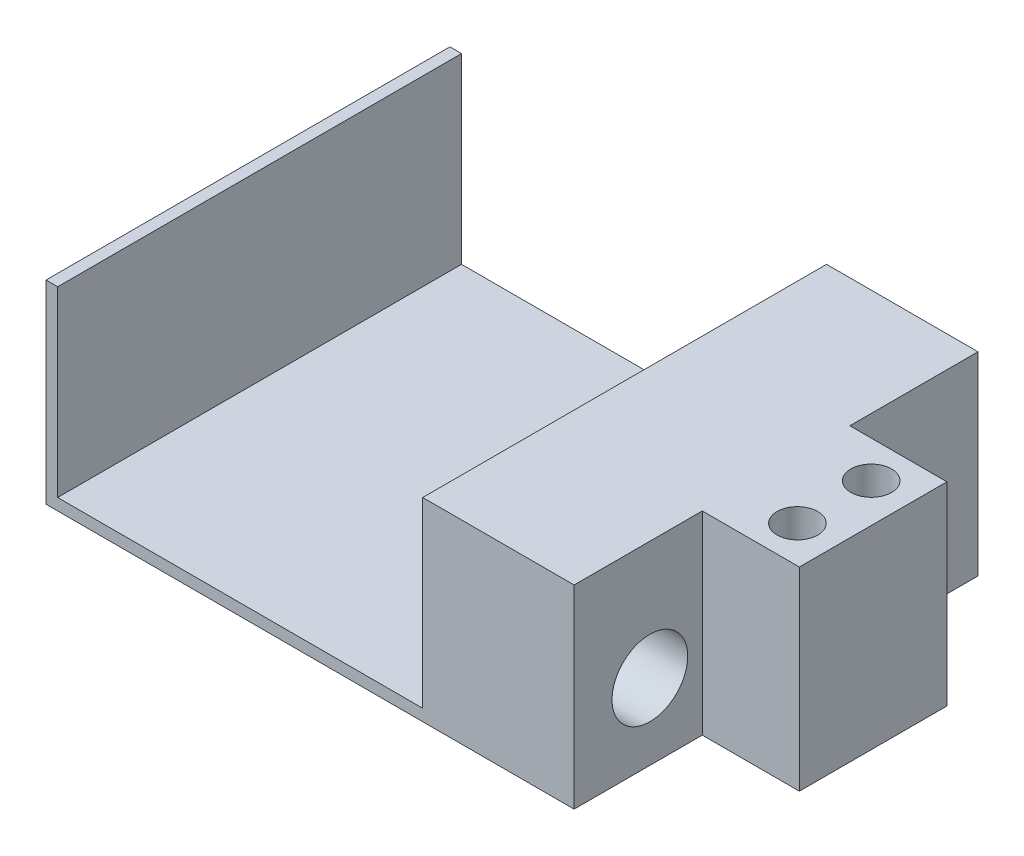
ISO-10303-21;
HEADER;
FILE_DESCRIPTION(('STEP AP214'),'2;1');
FILE_NAME('part.step','',(''),(''),'','','');
FILE_SCHEMA(('AUTOMOTIVE_DESIGN { 1 0 10303 214 1 1 1 1 }'));
ENDSEC;
DATA;
#1=APPLICATION_CONTEXT('core data for automotive mechanical design processes');
#2=APPLICATION_PROTOCOL_DEFINITION('international standard','automotive_design',2000,#1);
#3=PRODUCT_CONTEXT('',#1,'mechanical');
#4=PRODUCT('Part','Part','',(#3));
#5=PRODUCT_RELATED_PRODUCT_CATEGORY('part','',(#4));
#6=PRODUCT_DEFINITION_FORMATION('','',#4);
#7=PRODUCT_DEFINITION_CONTEXT('part definition',#1,'design');
#8=PRODUCT_DEFINITION('design','',#6,#7);
#9=PRODUCT_DEFINITION_SHAPE('','',#8);
#10=(LENGTH_UNIT() NAMED_UNIT(*) SI_UNIT(.MILLI.,.METRE.));
#11=(NAMED_UNIT(*) PLANE_ANGLE_UNIT() SI_UNIT($,.RADIAN.));
#12=(NAMED_UNIT(*) SI_UNIT($,.STERADIAN.) SOLID_ANGLE_UNIT());
#13=UNCERTAINTY_MEASURE_WITH_UNIT(LENGTH_MEASURE(1.E-05),#10,'distance_accuracy_value','');
#14=(GEOMETRIC_REPRESENTATION_CONTEXT(3) GLOBAL_UNCERTAINTY_ASSIGNED_CONTEXT((#13)) GLOBAL_UNIT_ASSIGNED_CONTEXT((#10,
#11,#12)) REPRESENTATION_CONTEXT('',''));
#15=CARTESIAN_POINT('',(0.,0.,0.));
#16=DIRECTION('',(0.,0.,1.));
#17=DIRECTION('',(1.,0.,0.));
#18=AXIS2_PLACEMENT_3D('',#15,#16,#17);
#19=CARTESIAN_POINT('',(22.2512626584708,-30.5,22.5));
#20=DIRECTION('',(1.,0.,0.));
#21=DIRECTION('',(0.,0.,-1.));
#22=AXIS2_PLACEMENT_3D('',#19,#20,#21);
#23=CYLINDRICAL_SURFACE('',#22,8.75);
#24=CARTESIAN_POINT('',(47.,-30.5,22.5));
#25=DIRECTION('',(1.,0.,0.));
#26=DIRECTION('',(0.,0.,-1.));
#27=AXIS2_PLACEMENT_3D('',#24,#25,#26);
#28=CIRCLE('',#27,8.75);
#29=CARTESIAN_POINT('',(47.,-30.5,13.75));
#30=VERTEX_POINT('',#29);
#31=EDGE_CURVE('E136',#30,#30,#28,.F.);
#32=ORIENTED_EDGE('',*,*,#31,.T.);
#33=EDGE_LOOP('',(#32));
#34=FACE_BOUND('',#33,.T.);
#35=CARTESIAN_POINT('',(70.,-30.5,22.5));
#36=DIRECTION('',(1.,0.,0.));
#37=DIRECTION('',(0.,0.,-1.));
#38=AXIS2_PLACEMENT_3D('',#35,#36,#37);
#39=CIRCLE('',#38,8.75);
#40=CARTESIAN_POINT('',(70.,-30.5,13.75));
#41=VERTEX_POINT('',#40);
#42=EDGE_CURVE('E133',#41,#41,#39,.F.);
#43=ORIENTED_EDGE('',*,*,#42,.F.);
#44=EDGE_LOOP('',(#43));
#45=FACE_BOUND('',#44,.T.);
#46=ADVANCED_FACE('F35',(#34,#45),#23,.F.);
#47=CARTESIAN_POINT('',(46.,-30.5,87.5));
#48=DIRECTION('',(1.,0.,0.));
#49=DIRECTION('',(0.,0.,-1.));
#50=AXIS2_PLACEMENT_3D('',#47,#48,#49);
#51=CYLINDRICAL_SURFACE('',#50,8.75);
#52=CARTESIAN_POINT('',(47.,-30.5,87.5));
#53=DIRECTION('',(1.,0.,0.));
#54=DIRECTION('',(0.,0.,-1.));
#55=AXIS2_PLACEMENT_3D('',#52,#53,#54);
#56=CIRCLE('',#55,8.75);
#57=CARTESIAN_POINT('',(47.,-30.5,78.75));
#58=VERTEX_POINT('',#57);
#59=EDGE_CURVE('E82',#58,#58,#56,.T.);
#60=CARTESIAN_POINT('',(70.,-30.5,87.5));
#61=DIRECTION('',(1.,0.,0.));
#62=DIRECTION('',(0.,0.,-1.));
#63=AXIS2_PLACEMENT_3D('',#60,#61,#62);
#64=CIRCLE('',#63,8.75);
#65=CARTESIAN_POINT('',(70.,-30.5,78.75));
#66=VERTEX_POINT('',#65);
#67=EDGE_CURVE('E129',#66,#66,#64,.F.);
#68=CARTESIAN_POINT('',(47.,-30.5,78.75));
#69=CARTESIAN_POINT('',(47.2395833333333,-30.5,78.75));
#70=CARTESIAN_POINT('',(47.4791666666667,-30.5,78.75));
#71=CARTESIAN_POINT('',(47.9583333333333,-30.5,78.75));
#72=CARTESIAN_POINT('',(48.1979166666667,-30.5,78.75));
#73=CARTESIAN_POINT('',(48.6770833333333,-30.5,78.75));
#74=CARTESIAN_POINT('',(48.9166666666667,-30.5,78.75));
#75=CARTESIAN_POINT('',(49.3958333333333,-30.5,78.75));
#76=CARTESIAN_POINT('',(49.6354166666667,-30.5,78.75));
#77=CARTESIAN_POINT('',(50.1145833333333,-30.5,78.75));
#78=CARTESIAN_POINT('',(50.3541666666667,-30.5,78.75));
#79=CARTESIAN_POINT('',(50.8333333333333,-30.5,78.75));
#80=CARTESIAN_POINT('',(51.0729166666667,-30.5,78.75));
#81=CARTESIAN_POINT('',(51.5520833333333,-30.5,78.75));
#82=CARTESIAN_POINT('',(51.7916666666667,-30.5,78.75));
#83=CARTESIAN_POINT('',(52.2708333333333,-30.5,78.75));
#84=CARTESIAN_POINT('',(52.5104166666667,-30.5,78.75));
#85=CARTESIAN_POINT('',(52.9895833333333,-30.5,78.75));
#86=CARTESIAN_POINT('',(53.2291666666667,-30.5,78.75));
#87=CARTESIAN_POINT('',(53.7083333333333,-30.5,78.75));
#88=CARTESIAN_POINT('',(53.9479166666667,-30.5,78.75));
#89=CARTESIAN_POINT('',(54.4270833333333,-30.5,78.75));
#90=CARTESIAN_POINT('',(54.6666666666667,-30.5,78.75));
#91=CARTESIAN_POINT('',(55.1458333333333,-30.5,78.75));
#92=CARTESIAN_POINT('',(55.3854166666667,-30.5,78.75));
#93=CARTESIAN_POINT('',(55.8645833333333,-30.5,78.75));
#94=CARTESIAN_POINT('',(56.1041666666667,-30.5,78.75));
#95=CARTESIAN_POINT('',(56.5833333333333,-30.5,78.75));
#96=CARTESIAN_POINT('',(56.8229166666667,-30.5,78.75));
#97=CARTESIAN_POINT('',(57.3020833333333,-30.5,78.75));
#98=CARTESIAN_POINT('',(57.5416666666667,-30.5,78.75));
#99=CARTESIAN_POINT('',(58.0208333333333,-30.5,78.75));
#100=CARTESIAN_POINT('',(58.2604166666667,-30.5,78.75));
#101=CARTESIAN_POINT('',(58.7395833333333,-30.5,78.75));
#102=CARTESIAN_POINT('',(58.9791666666667,-30.5,78.75));
#103=CARTESIAN_POINT('',(59.4583333333333,-30.5,78.75));
#104=CARTESIAN_POINT('',(59.6979166666667,-30.5,78.75));
#105=CARTESIAN_POINT('',(60.1770833333333,-30.5,78.75));
#106=CARTESIAN_POINT('',(60.4166666666667,-30.5,78.75));
#107=CARTESIAN_POINT('',(60.8958333333333,-30.5,78.75));
#108=CARTESIAN_POINT('',(61.1354166666667,-30.5,78.75));
#109=CARTESIAN_POINT('',(61.6145833333333,-30.5,78.75));
#110=CARTESIAN_POINT('',(61.8541666666667,-30.5,78.75));
#111=CARTESIAN_POINT('',(62.3333333333333,-30.5,78.75));
#112=CARTESIAN_POINT('',(62.5729166666667,-30.5,78.75));
#113=CARTESIAN_POINT('',(63.0520833333333,-30.5,78.75));
#114=CARTESIAN_POINT('',(63.2916666666667,-30.5,78.75));
#115=CARTESIAN_POINT('',(63.7708333333333,-30.5,78.75));
#116=CARTESIAN_POINT('',(64.0104166666667,-30.5,78.75));
#117=CARTESIAN_POINT('',(64.4895833333333,-30.5,78.75));
#118=CARTESIAN_POINT('',(64.7291666666667,-30.5,78.75));
#119=CARTESIAN_POINT('',(65.2083333333333,-30.5,78.75));
#120=CARTESIAN_POINT('',(65.4479166666667,-30.5,78.75));
#121=CARTESIAN_POINT('',(65.9270833333333,-30.5,78.75));
#122=CARTESIAN_POINT('',(66.1666666666667,-30.5,78.75));
#123=CARTESIAN_POINT('',(66.6458333333333,-30.5,78.75));
#124=CARTESIAN_POINT('',(66.8854166666667,-30.5,78.75));
#125=CARTESIAN_POINT('',(67.3645833333333,-30.5,78.75));
#126=CARTESIAN_POINT('',(67.6041666666667,-30.5,78.75));
#127=CARTESIAN_POINT('',(68.0833333333333,-30.5,78.75));
#128=CARTESIAN_POINT('',(68.3229166666667,-30.5,78.75));
#129=CARTESIAN_POINT('',(68.8020833333333,-30.5,78.75));
#130=CARTESIAN_POINT('',(69.0416666666667,-30.5,78.75));
#131=CARTESIAN_POINT('',(69.5208333333333,-30.5,78.75));
#132=CARTESIAN_POINT('',(69.7604166666667,-30.5,78.75));
#133=CARTESIAN_POINT('',(70.,-30.5,78.75));
#134=B_SPLINE_CURVE_WITH_KNOTS('',3,(#68,#69,#70,#71,#72,#73,#74,#75,#76,#77,#78,#79,#80,#81,
#82,#83,#84,#85,#86,#87,#88,#89,#90,#91,#92,#93,#94,#95,#96,#97,#98,#99,#100,#101,#102,#103,
#104,#105,#106,#107,#108,#109,#110,#111,#112,#113,#114,#115,#116,#117,#118,#119,#120,#121,#122,
#123,#124,#125,#126,#127,#128,#129,#130,#131,#132,#133),.UNSPECIFIED.,.F.,.F.,(4,2,2,2,2,2,2,2,
2,2,2,2,2,2,2,2,2,2,2,2,2,2,2,2,2,2,2,2,2,2,2,2,4),(0.,0.718750000000004,1.4375,
2.15625000000001,2.875,3.59375,4.3125,5.03125,5.75,6.46875,7.1875,7.90625,8.625,9.34375,10.0625,
10.78125,11.5,12.21875,12.9375,13.65625,14.375,15.09375,15.8125,16.53125,17.25,17.96875,18.6875,
19.40625,20.125,20.84375,21.5625,22.28125,23.),.UNSPECIFIED.);
#135=EDGE_CURVE('BSEAM315',#58,#66,#134,.T.);
#136=ORIENTED_EDGE('',*,*,#59,.F.);
#137=ORIENTED_EDGE('',*,*,#67,.F.);
#138=ORIENTED_EDGE('',*,*,#135,.T.);
#139=ORIENTED_EDGE('',*,*,#135,.F.);
#140=EDGE_LOOP('',(#136,#138,#137,#139));
#141=FACE_BOUND('',#140,.T.);
#142=ADVANCED_FACE('F315',(#141),#51,.F.);
#143=CARTESIAN_POINT('',(0.,0.,107.));
#144=DIRECTION('',(0.,0.,-1.));
#145=DIRECTION('',(-1.,0.,0.));
#146=AXIS2_PLACEMENT_3D('',#143,#144,#145);
#147=PLANE('',#146);
#148=DIRECTION('',(-1.,0.,0.));
#149=VECTOR('',#148,1.);
#150=CARTESIAN_POINT('',(0.,-50.,107.));
#151=LINE('',#150,#149);
#152=CARTESIAN_POINT('',(86.,-50.,107.));
#153=VERTEX_POINT('',#152);
#154=CARTESIAN_POINT('',(-50.,-50.,107.));
#155=VERTEX_POINT('',#154);
#156=EDGE_CURVE('E109',#153,#155,#151,.T.);
#157=ORIENTED_EDGE('',*,*,#156,.F.);
#158=DIRECTION('',(0.,1.,0.));
#159=VECTOR('',#158,1.);
#160=CARTESIAN_POINT('',(86.,-83.3766385365573,107.));
#161=LINE('',#160,#159);
#162=CARTESIAN_POINT('',(86.,0.,107.));
#163=VERTEX_POINT('',#162);
#164=EDGE_CURVE('E168',#153,#163,#161,.T.);
#165=ORIENTED_EDGE('',*,*,#164,.T.);
#166=DIRECTION('',(-1.,0.,0.));
#167=VECTOR('',#166,1.);
#168=CARTESIAN_POINT('',(0.,0.,107.));
#169=LINE('',#168,#167);
#170=CARTESIAN_POINT('',(47.,0.,107.));
#171=VERTEX_POINT('',#170);
#172=EDGE_CURVE('E54',#163,#171,#169,.T.);
#173=ORIENTED_EDGE('',*,*,#172,.T.);
#174=DIRECTION('',(0.,1.,0.));
#175=VECTOR('',#174,1.);
#176=CARTESIAN_POINT('',(47.,-47.,107.));
#177=LINE('',#176,#175);
#178=CARTESIAN_POINT('',(47.,-47.,107.));
#179=VERTEX_POINT('',#178);
#180=EDGE_CURVE('E68',#179,#171,#177,.T.);
#181=ORIENTED_EDGE('',*,*,#180,.F.);
#182=DIRECTION('',(1.,0.,0.));
#183=VECTOR('',#182,1.);
#184=CARTESIAN_POINT('',(-47.,-47.,107.));
#185=LINE('',#184,#183);
#186=CARTESIAN_POINT('',(-47.,-47.,107.));
#187=VERTEX_POINT('',#186);
#188=EDGE_CURVE('E84',#187,#179,#185,.T.);
#189=ORIENTED_EDGE('',*,*,#188,.F.);
#190=DIRECTION('',(0.,1.,0.));
#191=VECTOR('',#190,1.);
#192=CARTESIAN_POINT('',(-47.,-47.,107.));
#193=LINE('',#192,#191);
#194=CARTESIAN_POINT('',(-47.,0.,107.));
#195=VERTEX_POINT('',#194);
#196=EDGE_CURVE('E74',#187,#195,#193,.T.);
#197=ORIENTED_EDGE('',*,*,#196,.T.);
#198=DIRECTION('',(-1.,0.,0.));
#199=VECTOR('',#198,1.);
#200=CARTESIAN_POINT('',(0.,0.,107.));
#201=LINE('',#200,#199);
#202=CARTESIAN_POINT('',(-50.,0.,107.));
#203=VERTEX_POINT('',#202);
#204=EDGE_CURVE('E117',#195,#203,#201,.T.);
#205=ORIENTED_EDGE('',*,*,#204,.T.);
#206=DIRECTION('',(0.,1.,0.));
#207=VECTOR('',#206,1.);
#208=CARTESIAN_POINT('',(-50.,0.,107.));
#209=LINE('',#208,#207);
#210=EDGE_CURVE('E113',#155,#203,#209,.T.);
#211=ORIENTED_EDGE('',*,*,#210,.F.);
#212=EDGE_LOOP('',(#157,#165,#173,#181,#189,#197,#205,#211));
#213=FACE_BOUND('',#212,.T.);
#214=ADVANCED_FACE('F86',(#213),#147,.F.);
#215=CARTESIAN_POINT('',(0.,0.,3.));
#216=DIRECTION('',(0.,0.,1.));
#217=DIRECTION('',(1.,0.,0.));
#218=AXIS2_PLACEMENT_3D('',#215,#216,#217);
#219=PLANE('',#218);
#220=DIRECTION('',(1.,0.,0.));
#221=VECTOR('',#220,1.);
#222=CARTESIAN_POINT('',(0.,0.,3.));
#223=LINE('',#222,#221);
#224=CARTESIAN_POINT('',(47.,0.,3.));
#225=VERTEX_POINT('',#224);
#226=CARTESIAN_POINT('',(86.,0.,3.));
#227=VERTEX_POINT('',#226);
#228=EDGE_CURVE('E118',#225,#227,#223,.T.);
#229=ORIENTED_EDGE('',*,*,#228,.T.);
#230=DIRECTION('',(0.,1.,0.));
#231=VECTOR('',#230,1.);
#232=CARTESIAN_POINT('',(86.,-83.3766385365573,3.));
#233=LINE('',#232,#231);
#234=CARTESIAN_POINT('',(86.,-50.,3.));
#235=VERTEX_POINT('',#234);
#236=EDGE_CURVE('E180',#235,#227,#233,.T.);
#237=ORIENTED_EDGE('',*,*,#236,.F.);
#238=DIRECTION('',(1.,0.,0.));
#239=VECTOR('',#238,1.);
#240=CARTESIAN_POINT('',(0.,-50.,3.));
#241=LINE('',#240,#239);
#242=CARTESIAN_POINT('',(-50.,-50.,3.));
#243=VERTEX_POINT('',#242);
#244=EDGE_CURVE('E105',#243,#235,#241,.T.);
#245=ORIENTED_EDGE('',*,*,#244,.F.);
#246=DIRECTION('',(0.,-1.,0.));
#247=VECTOR('',#246,1.);
#248=CARTESIAN_POINT('',(-50.,0.,3.));
#249=LINE('',#248,#247);
#250=CARTESIAN_POINT('',(-50.,0.,3.));
#251=VERTEX_POINT('',#250);
#252=EDGE_CURVE('E110',#251,#243,#249,.T.);
#253=ORIENTED_EDGE('',*,*,#252,.F.);
#254=DIRECTION('',(1.,0.,0.));
#255=VECTOR('',#254,1.);
#256=CARTESIAN_POINT('',(0.,0.,3.));
#257=LINE('',#256,#255);
#258=CARTESIAN_POINT('',(-47.,0.,3.));
#259=VERTEX_POINT('',#258);
#260=EDGE_CURVE('E114',#251,#259,#257,.T.);
#261=ORIENTED_EDGE('',*,*,#260,.T.);
#262=DIRECTION('',(0.,1.,0.));
#263=VECTOR('',#262,1.);
#264=CARTESIAN_POINT('',(-47.,-47.,3.));
#265=LINE('',#264,#263);
#266=CARTESIAN_POINT('',(-47.,-47.,3.));
#267=VERTEX_POINT('',#266);
#268=EDGE_CURVE('E102',#267,#259,#265,.T.);
#269=ORIENTED_EDGE('',*,*,#268,.F.);
#270=DIRECTION('',(-1.,0.,0.));
#271=VECTOR('',#270,1.);
#272=CARTESIAN_POINT('',(-47.,-47.,3.));
#273=LINE('',#272,#271);
#274=CARTESIAN_POINT('',(47.,-47.,3.));
#275=VERTEX_POINT('',#274);
#276=EDGE_CURVE('E95',#275,#267,#273,.T.);
#277=ORIENTED_EDGE('',*,*,#276,.F.);
#278=DIRECTION('',(0.,1.,0.));
#279=VECTOR('',#278,1.);
#280=CARTESIAN_POINT('',(47.,-47.,3.));
#281=LINE('',#280,#279);
#282=EDGE_CURVE('E81',#275,#225,#281,.T.);
#283=ORIENTED_EDGE('',*,*,#282,.T.);
#284=EDGE_LOOP('',(#229,#237,#245,#253,#261,#269,#277,#283));
#285=FACE_BOUND('',#284,.T.);
#286=ADVANCED_FACE('F222',(#285),#219,.F.);
#287=CARTESIAN_POINT('',(-50.,0.,110.));
#288=DIRECTION('',(1.,0.,0.));
#289=DIRECTION('',(0.,1.,0.));
#290=AXIS2_PLACEMENT_3D('',#287,#288,#289);
#291=PLANE('',#290);
#292=DIRECTION('',(0.,0.,-1.));
#293=VECTOR('',#292,1.);
#294=CARTESIAN_POINT('',(-50.,-50.,110.));
#295=LINE('',#294,#293);
#296=EDGE_CURVE('E104',#155,#243,#295,.T.);
#297=ORIENTED_EDGE('',*,*,#296,.F.);
#298=ORIENTED_EDGE('',*,*,#210,.T.);
#299=DIRECTION('',(0.,0.,-1.));
#300=VECTOR('',#299,1.);
#301=CARTESIAN_POINT('',(-50.,0.,110.));
#302=LINE('',#301,#300);
#303=EDGE_CURVE('E108',#203,#251,#302,.T.);
#304=ORIENTED_EDGE('',*,*,#303,.T.);
#305=ORIENTED_EDGE('',*,*,#252,.T.);
#306=EDGE_LOOP('',(#297,#298,#304,#305));
#307=FACE_BOUND('',#306,.T.);
#308=ADVANCED_FACE('F333',(#307),#291,.F.);
#309=CARTESIAN_POINT('',(0.,-50.,110.));
#310=DIRECTION('',(0.,1.,0.));
#311=DIRECTION('',(0.,0.,1.));
#312=AXIS2_PLACEMENT_3D('',#309,#310,#311);
#313=PLANE('',#312);
#314=CARTESIAN_POINT('',(101.,-50.,64.5));
#315=DIRECTION('',(0.,1.,0.));
#316=DIRECTION('',(0.,0.,1.));
#317=AXIS2_PLACEMENT_3D('',#314,#315,#316);
#318=CIRCLE('',#317,5.25);
#319=CARTESIAN_POINT('',(101.,-50.,69.75));
#320=VERTEX_POINT('',#319);
#321=EDGE_CURVE('E165',#320,#320,#318,.F.);
#322=ORIENTED_EDGE('',*,*,#321,.F.);
#323=EDGE_LOOP('',(#322));
#324=FACE_BOUND('',#323,.T.);
#325=CARTESIAN_POINT('',(101.,-50.,45.5));
#326=DIRECTION('',(0.,1.,0.));
#327=DIRECTION('',(0.,0.,1.));
#328=AXIS2_PLACEMENT_3D('',#325,#326,#327);
#329=CIRCLE('',#328,5.25);
#330=CARTESIAN_POINT('',(101.,-50.,50.75));
#331=VERTEX_POINT('',#330);
#332=EDGE_CURVE('E191',#331,#331,#329,.F.);
#333=ORIENTED_EDGE('',*,*,#332,.F.);
#334=EDGE_LOOP('',(#333));
#335=FACE_BOUND('',#334,.T.);
#336=DIRECTION('',(0.,0.,-1.));
#337=VECTOR('',#336,1.);
#338=CARTESIAN_POINT('',(86.,-50.,3.));
#339=LINE('',#338,#337);
#340=CARTESIAN_POINT('',(86.,-50.,36.));
#341=VERTEX_POINT('',#340);
#342=EDGE_CURVE('E297',#341,#235,#339,.T.);
#343=ORIENTED_EDGE('',*,*,#342,.F.);
#344=DIRECTION('',(-1.,0.,0.));
#345=VECTOR('',#344,1.);
#346=CARTESIAN_POINT('',(111.,-50.,36.));
#347=LINE('',#346,#345);
#348=CARTESIAN_POINT('',(111.,-50.,36.));
#349=VERTEX_POINT('',#348);
#350=EDGE_CURVE('E141',#349,#341,#347,.T.);
#351=ORIENTED_EDGE('',*,*,#350,.F.);
#352=DIRECTION('',(0.,0.,-1.));
#353=VECTOR('',#352,1.);
#354=CARTESIAN_POINT('',(111.,-50.,74.));
#355=LINE('',#354,#353);
#356=CARTESIAN_POINT('',(111.,-50.,74.));
#357=VERTEX_POINT('',#356);
#358=EDGE_CURVE('E197',#357,#349,#355,.T.);
#359=ORIENTED_EDGE('',*,*,#358,.F.);
#360=DIRECTION('',(-1.,0.,0.));
#361=VECTOR('',#360,1.);
#362=CARTESIAN_POINT('',(111.,-50.,74.));
#363=LINE('',#362,#361);
#364=CARTESIAN_POINT('',(86.,-50.,74.));
#365=VERTEX_POINT('',#364);
#366=EDGE_CURVE('E147',#357,#365,#363,.T.);
#367=ORIENTED_EDGE('',*,*,#366,.T.);
#368=DIRECTION('',(0.,0.,-1.));
#369=VECTOR('',#368,1.);
#370=CARTESIAN_POINT('',(86.,-50.,107.));
#371=LINE('',#370,#369);
#372=EDGE_CURVE('E161',#153,#365,#371,.T.);
#373=ORIENTED_EDGE('',*,*,#372,.F.);
#374=ORIENTED_EDGE('',*,*,#156,.T.);
#375=ORIENTED_EDGE('',*,*,#296,.T.);
#376=ORIENTED_EDGE('',*,*,#244,.T.);
#377=EDGE_LOOP('',(#343,#351,#359,#367,#373,#374,#375,#376));
#378=FACE_BOUND('',#377,.T.);
#379=ADVANCED_FACE('F37',(#324,#335,#378),#313,.F.);
#380=CARTESIAN_POINT('',(0.,0.,110.));
#381=DIRECTION('',(0.,1.,0.));
#382=DIRECTION('',(0.,0.,1.));
#383=AXIS2_PLACEMENT_3D('',#380,#381,#382);
#384=PLANE('',#383);
#385=DIRECTION('',(-1.,0.,0.));
#386=VECTOR('',#385,1.);
#387=CARTESIAN_POINT('',(111.,0.,36.));
#388=LINE('',#387,#386);
#389=CARTESIAN_POINT('',(111.,0.,36.));
#390=VERTEX_POINT('',#389);
#391=CARTESIAN_POINT('',(86.,0.,36.));
#392=VERTEX_POINT('',#391);
#393=EDGE_CURVE('E138',#390,#392,#388,.T.);
#394=ORIENTED_EDGE('',*,*,#393,.T.);
#395=DIRECTION('',(0.,0.,1.));
#396=VECTOR('',#395,1.);
#397=CARTESIAN_POINT('',(86.,0.,3.));
#398=LINE('',#397,#396);
#399=EDGE_CURVE('E264',#227,#392,#398,.T.);
#400=ORIENTED_EDGE('',*,*,#399,.F.);
#401=ORIENTED_EDGE('',*,*,#228,.F.);
#402=DIRECTION('',(0.,0.,-1.));
#403=VECTOR('',#402,1.);
#404=CARTESIAN_POINT('',(47.,0.,3.));
#405=LINE('',#404,#403);
#406=EDGE_CURVE('E45',#171,#225,#405,.T.);
#407=ORIENTED_EDGE('',*,*,#406,.F.);
#408=ORIENTED_EDGE('',*,*,#172,.F.);
#409=DIRECTION('',(0.,0.,1.));
#410=VECTOR('',#409,1.);
#411=CARTESIAN_POINT('',(86.,0.,107.));
#412=LINE('',#411,#410);
#413=CARTESIAN_POINT('',(86.,0.,74.));
#414=VERTEX_POINT('',#413);
#415=EDGE_CURVE('E182',#414,#163,#412,.T.);
#416=ORIENTED_EDGE('',*,*,#415,.F.);
#417=DIRECTION('',(-1.,0.,0.));
#418=VECTOR('',#417,1.);
#419=CARTESIAN_POINT('',(111.,0.,74.));
#420=LINE('',#419,#418);
#421=CARTESIAN_POINT('',(111.,0.,74.));
#422=VERTEX_POINT('',#421);
#423=EDGE_CURVE('E142',#422,#414,#420,.T.);
#424=ORIENTED_EDGE('',*,*,#423,.F.);
#425=DIRECTION('',(0.,0.,1.));
#426=VECTOR('',#425,1.);
#427=CARTESIAN_POINT('',(111.,0.,74.));
#428=LINE('',#427,#426);
#429=EDGE_CURVE('E156',#390,#422,#428,.T.);
#430=ORIENTED_EDGE('',*,*,#429,.F.);
#431=EDGE_LOOP('',(#394,#400,#401,#407,#408,#416,#424,#430));
#432=FACE_BOUND('',#431,.T.);
#433=CARTESIAN_POINT('',(101.,0.,64.5));
#434=DIRECTION('',(0.,1.,0.));
#435=DIRECTION('',(0.,0.,1.));
#436=AXIS2_PLACEMENT_3D('',#433,#434,#435);
#437=CIRCLE('',#436,5.25);
#438=CARTESIAN_POINT('',(101.,0.,69.75));
#439=VERTEX_POINT('',#438);
#440=EDGE_CURVE('E160',#439,#439,#437,.T.);
#441=ORIENTED_EDGE('',*,*,#440,.F.);
#442=EDGE_LOOP('',(#441));
#443=FACE_BOUND('',#442,.T.);
#444=CARTESIAN_POINT('',(101.,0.,45.5));
#445=DIRECTION('',(0.,1.,0.));
#446=DIRECTION('',(0.,0.,1.));
#447=AXIS2_PLACEMENT_3D('',#444,#445,#446);
#448=CIRCLE('',#447,5.25);
#449=CARTESIAN_POINT('',(101.,0.,50.75));
#450=VERTEX_POINT('',#449);
#451=EDGE_CURVE('E188',#450,#450,#448,.T.);
#452=ORIENTED_EDGE('',*,*,#451,.F.);
#453=EDGE_LOOP('',(#452));
#454=FACE_BOUND('',#453,.T.);
#455=ADVANCED_FACE('F260',(#432,#443,#454),#384,.T.);
#456=ORIENTED_EDGE('',*,*,#204,.F.);
#457=DIRECTION('',(0.,0.,1.));
#458=VECTOR('',#457,1.);
#459=CARTESIAN_POINT('',(-47.,0.,3.));
#460=LINE('',#459,#458);
#461=EDGE_CURVE('E11',#259,#195,#460,.T.);
#462=ORIENTED_EDGE('',*,*,#461,.F.);
#463=ORIENTED_EDGE('',*,*,#260,.F.);
#464=ORIENTED_EDGE('',*,*,#303,.F.);
#465=EDGE_LOOP('',(#456,#462,#463,#464));
#466=FACE_BOUND('',#465,.T.);
#467=ADVANCED_FACE('F230',(#466),#384,.T.);
#468=CARTESIAN_POINT('',(47.,-47.,3.));
#469=DIRECTION('',(1.,0.,0.));
#470=DIRECTION('',(0.,0.,-1.));
#471=AXIS2_PLACEMENT_3D('',#468,#469,#470);
#472=PLANE('',#471);
#473=ORIENTED_EDGE('',*,*,#31,.F.);
#474=EDGE_LOOP('',(#473));
#475=FACE_BOUND('',#474,.T.);
#476=ORIENTED_EDGE('',*,*,#59,.T.);
#477=EDGE_LOOP('',(#476));
#478=FACE_BOUND('',#477,.T.);
#479=ORIENTED_EDGE('',*,*,#406,.T.);
#480=ORIENTED_EDGE('',*,*,#282,.F.);
#481=DIRECTION('',(0.,0.,-1.));
#482=VECTOR('',#481,1.);
#483=CARTESIAN_POINT('',(47.,-47.,3.));
#484=LINE('',#483,#482);
#485=EDGE_CURVE('E90',#179,#275,#484,.T.);
#486=ORIENTED_EDGE('',*,*,#485,.F.);
#487=ORIENTED_EDGE('',*,*,#180,.T.);
#488=EDGE_LOOP('',(#479,#480,#486,#487));
#489=FACE_BOUND('',#488,.T.);
#490=ADVANCED_FACE('F218',(#475,#478,#489),#472,.F.);
#491=CARTESIAN_POINT('',(-47.,-47.,3.));
#492=DIRECTION('',(-1.,0.,0.));
#493=DIRECTION('',(0.,0.,1.));
#494=AXIS2_PLACEMENT_3D('',#491,#492,#493);
#495=PLANE('',#494);
#496=ORIENTED_EDGE('',*,*,#461,.T.);
#497=ORIENTED_EDGE('',*,*,#196,.F.);
#498=DIRECTION('',(0.,0.,1.));
#499=VECTOR('',#498,1.);
#500=CARTESIAN_POINT('',(-47.,-47.,3.));
#501=LINE('',#500,#499);
#502=EDGE_CURVE('E77',#267,#187,#501,.T.);
#503=ORIENTED_EDGE('',*,*,#502,.F.);
#504=ORIENTED_EDGE('',*,*,#268,.T.);
#505=EDGE_LOOP('',(#496,#497,#503,#504));
#506=FACE_BOUND('',#505,.T.);
#507=ADVANCED_FACE('F75',(#506),#495,.F.);
#508=CARTESIAN_POINT('',(0.,-47.,0.));
#509=DIRECTION('',(0.,1.,0.));
#510=DIRECTION('',(0.,0.,1.));
#511=AXIS2_PLACEMENT_3D('',#508,#509,#510);
#512=PLANE('',#511);
#513=ORIENTED_EDGE('',*,*,#502,.T.);
#514=ORIENTED_EDGE('',*,*,#188,.T.);
#515=ORIENTED_EDGE('',*,*,#485,.T.);
#516=ORIENTED_EDGE('',*,*,#276,.T.);
#517=EDGE_LOOP('',(#513,#514,#515,#516));
#518=FACE_BOUND('',#517,.T.);
#519=ADVANCED_FACE('F93',(#518),#512,.T.);
#520=CARTESIAN_POINT('',(70.,-30.5,87.5));
#521=DIRECTION('',(1.,0.,0.));
#522=DIRECTION('',(0.,0.,-1.));
#523=AXIS2_PLACEMENT_3D('',#520,#521,#522);
#524=PLANE('',#523);
#525=CARTESIAN_POINT('',(70.,-30.5,87.5));
#526=DIRECTION('',(1.,0.,0.));
#527=DIRECTION('',(0.,0.,-1.));
#528=AXIS2_PLACEMENT_3D('',#525,#526,#527);
#529=CIRCLE('',#528,9.74999999999999);
#530=CARTESIAN_POINT('',(70.,-30.5,77.75));
#531=VERTEX_POINT('',#530);
#532=EDGE_CURVE('E132',#531,#531,#529,.T.);
#533=ORIENTED_EDGE('',*,*,#532,.T.);
#534=EDGE_LOOP('',(#533));
#535=FACE_BOUND('',#534,.T.);
#536=ORIENTED_EDGE('',*,*,#67,.T.);
#537=EDGE_LOOP('',(#536));
#538=FACE_BOUND('',#537,.T.);
#539=ADVANCED_FACE('F328',(#535,#538),#524,.T.);
#540=CARTESIAN_POINT('',(70.,-30.5,87.5));
#541=DIRECTION('',(1.,0.,0.));
#542=DIRECTION('',(0.,0.,-1.));
#543=AXIS2_PLACEMENT_3D('',#540,#541,#542);
#544=CYLINDRICAL_SURFACE('',#543,9.74999999999999);
#545=CARTESIAN_POINT('',(86.,-30.5,87.5));
#546=DIRECTION('',(-1.,0.,0.));
#547=DIRECTION('',(0.,0.,1.));
#548=AXIS2_PLACEMENT_3D('',#545,#546,#547);
#549=CIRCLE('',#548,9.74999999999999);
#550=CARTESIAN_POINT('',(86.,-30.5,77.75));
#551=VERTEX_POINT('',#550);
#552=EDGE_CURVE('E158',#551,#551,#549,.F.);
#553=CARTESIAN_POINT('',(86.,-30.5,77.75));
#554=CARTESIAN_POINT('',(85.8333333333333,-30.5,77.75));
#555=CARTESIAN_POINT('',(85.6666666666667,-30.5,77.75));
#556=CARTESIAN_POINT('',(85.3333333333333,-30.5,77.75));
#557=CARTESIAN_POINT('',(85.1666666666667,-30.5,77.75));
#558=CARTESIAN_POINT('',(84.8333333333333,-30.5,77.75));
#559=CARTESIAN_POINT('',(84.6666666666667,-30.5,77.75));
#560=CARTESIAN_POINT('',(84.3333333333333,-30.5,77.75));
#561=CARTESIAN_POINT('',(84.1666666666667,-30.5,77.75));
#562=CARTESIAN_POINT('',(83.8333333333333,-30.5,77.75));
#563=CARTESIAN_POINT('',(83.6666666666667,-30.5,77.75));
#564=CARTESIAN_POINT('',(83.3333333333333,-30.5,77.75));
#565=CARTESIAN_POINT('',(83.1666666666667,-30.5,77.75));
#566=CARTESIAN_POINT('',(82.8333333333333,-30.5,77.75));
#567=CARTESIAN_POINT('',(82.6666666666667,-30.5,77.75));
#568=CARTESIAN_POINT('',(82.3333333333333,-30.5,77.75));
#569=CARTESIAN_POINT('',(82.1666666666667,-30.5,77.75));
#570=CARTESIAN_POINT('',(81.8333333333333,-30.5,77.75));
#571=CARTESIAN_POINT('',(81.6666666666667,-30.5,77.75));
#572=CARTESIAN_POINT('',(81.3333333333333,-30.5,77.75));
#573=CARTESIAN_POINT('',(81.1666666666667,-30.5,77.75));
#574=CARTESIAN_POINT('',(80.8333333333333,-30.5,77.75));
#575=CARTESIAN_POINT('',(80.6666666666667,-30.5,77.75));
#576=CARTESIAN_POINT('',(80.3333333333333,-30.5,77.75));
#577=CARTESIAN_POINT('',(80.1666666666667,-30.5,77.75));
#578=CARTESIAN_POINT('',(79.8333333333333,-30.5,77.75));
#579=CARTESIAN_POINT('',(79.6666666666667,-30.5,77.75));
#580=CARTESIAN_POINT('',(79.3333333333333,-30.5,77.75));
#581=CARTESIAN_POINT('',(79.1666666666667,-30.5,77.75));
#582=CARTESIAN_POINT('',(78.8333333333333,-30.5,77.75));
#583=CARTESIAN_POINT('',(78.6666666666667,-30.5,77.75));
#584=CARTESIAN_POINT('',(78.3333333333333,-30.5,77.75));
#585=CARTESIAN_POINT('',(78.1666666666667,-30.5,77.75));
#586=CARTESIAN_POINT('',(77.8333333333333,-30.5,77.75));
#587=CARTESIAN_POINT('',(77.6666666666667,-30.5,77.75));
#588=CARTESIAN_POINT('',(77.3333333333333,-30.5,77.75));
#589=CARTESIAN_POINT('',(77.1666666666667,-30.5,77.75));
#590=CARTESIAN_POINT('',(76.8333333333333,-30.5,77.75));
#591=CARTESIAN_POINT('',(76.6666666666667,-30.5,77.75));
#592=CARTESIAN_POINT('',(76.3333333333333,-30.5,77.75));
#593=CARTESIAN_POINT('',(76.1666666666667,-30.5,77.75));
#594=CARTESIAN_POINT('',(75.8333333333333,-30.5,77.75));
#595=CARTESIAN_POINT('',(75.6666666666667,-30.5,77.75));
#596=CARTESIAN_POINT('',(75.3333333333333,-30.5,77.75));
#597=CARTESIAN_POINT('',(75.1666666666667,-30.5,77.75));
#598=CARTESIAN_POINT('',(74.8333333333333,-30.5,77.75));
#599=CARTESIAN_POINT('',(74.6666666666667,-30.5,77.75));
#600=CARTESIAN_POINT('',(74.3333333333333,-30.5,77.75));
#601=CARTESIAN_POINT('',(74.1666666666667,-30.5,77.75));
#602=CARTESIAN_POINT('',(73.8333333333333,-30.5,77.75));
#603=CARTESIAN_POINT('',(73.6666666666667,-30.5,77.75));
#604=CARTESIAN_POINT('',(73.3333333333333,-30.5,77.75));
#605=CARTESIAN_POINT('',(73.1666666666667,-30.5,77.75));
#606=CARTESIAN_POINT('',(72.8333333333333,-30.5,77.75));
#607=CARTESIAN_POINT('',(72.6666666666667,-30.5,77.75));
#608=CARTESIAN_POINT('',(72.3333333333333,-30.5,77.75));
#609=CARTESIAN_POINT('',(72.1666666666667,-30.5,77.75));
#610=CARTESIAN_POINT('',(71.8333333333333,-30.5,77.75));
#611=CARTESIAN_POINT('',(71.6666666666667,-30.5,77.75));
#612=CARTESIAN_POINT('',(71.3333333333333,-30.5,77.75));
#613=CARTESIAN_POINT('',(71.1666666666667,-30.5,77.75));
#614=CARTESIAN_POINT('',(70.8333333333333,-30.5,77.75));
#615=CARTESIAN_POINT('',(70.6666666666667,-30.5,77.75));
#616=CARTESIAN_POINT('',(70.3333333333333,-30.5,77.75));
#617=CARTESIAN_POINT('',(70.1666666666667,-30.5,77.75));
#618=CARTESIAN_POINT('',(70.,-30.5,77.75));
#619=B_SPLINE_CURVE_WITH_KNOTS('',3,(#553,#554,#555,#556,#557,#558,#559,#560,#561,#562,#563,
#564,#565,#566,#567,#568,#569,#570,#571,#572,#573,#574,#575,#576,#577,#578,#579,#580,#581,#582,
#583,#584,#585,#586,#587,#588,#589,#590,#591,#592,#593,#594,#595,#596,#597,#598,#599,#600,#601,
#602,#603,#604,#605,#606,#607,#608,#609,#610,#611,#612,#613,#614,#615,#616,#617,#618),
.UNSPECIFIED.,.F.,.F.,(4,2,2,2,2,2,2,2,2,2,2,2,2,2,2,2,2,2,2,2,2,2,2,2,2,2,2,2,2,2,2,2,4),(0.,
0.5,1.,1.5,2.,2.5,3.,3.5,4.,4.5,5.,5.50000000000001,6.00000000000001,6.50000000000001,
7.00000000000001,7.50000000000001,8.00000000000001,8.50000000000001,9.00000000000001,
9.50000000000001,10.,10.5,11.,11.5,12.,12.5,13.,13.5,14.,14.5,15.,15.5,16.),.UNSPECIFIED.);
#620=EDGE_CURVE('BSEAM331',#551,#531,#619,.T.);
#621=ORIENTED_EDGE('',*,*,#552,.T.);
#622=ORIENTED_EDGE('',*,*,#532,.F.);
#623=ORIENTED_EDGE('',*,*,#620,.T.);
#624=ORIENTED_EDGE('',*,*,#620,.F.);
#625=EDGE_LOOP('',(#621,#623,#622,#624));
#626=FACE_BOUND('',#625,.T.);
#627=ADVANCED_FACE('F331',(#626),#544,.F.);
#628=CARTESIAN_POINT('',(70.,-30.5,22.5));
#629=DIRECTION('',(1.,0.,0.));
#630=DIRECTION('',(0.,0.,-1.));
#631=AXIS2_PLACEMENT_3D('',#628,#629,#630);
#632=PLANE('',#631);
#633=CARTESIAN_POINT('',(70.,-30.5,22.5));
#634=DIRECTION('',(1.,0.,0.));
#635=DIRECTION('',(0.,0.,-1.));
#636=AXIS2_PLACEMENT_3D('',#633,#634,#635);
#637=CIRCLE('',#636,9.75);
#638=CARTESIAN_POINT('',(70.,-30.5,12.75));
#639=VERTEX_POINT('',#638);
#640=EDGE_CURVE('E137',#639,#639,#637,.T.);
#641=ORIENTED_EDGE('',*,*,#640,.T.);
#642=EDGE_LOOP('',(#641));
#643=FACE_BOUND('',#642,.T.);
#644=ORIENTED_EDGE('',*,*,#42,.T.);
#645=EDGE_LOOP('',(#644));
#646=FACE_BOUND('',#645,.T.);
#647=ADVANCED_FACE('F335',(#643,#646),#632,.T.);
#648=CARTESIAN_POINT('',(70.,-30.5,22.5));
#649=DIRECTION('',(1.,0.,0.));
#650=DIRECTION('',(0.,0.,-1.));
#651=AXIS2_PLACEMENT_3D('',#648,#649,#650);
#652=CYLINDRICAL_SURFACE('',#651,9.75);
#653=CARTESIAN_POINT('',(86.,-30.5,22.5));
#654=DIRECTION('',(-1.,0.,0.));
#655=DIRECTION('',(0.,0.,1.));
#656=AXIS2_PLACEMENT_3D('',#653,#654,#655);
#657=CIRCLE('',#656,9.75);
#658=CARTESIAN_POINT('',(86.,-30.5,12.75));
#659=VERTEX_POINT('',#658);
#660=EDGE_CURVE('E39',#659,#659,#657,.F.);
#661=CARTESIAN_POINT('',(86.,-30.5,12.75));
#662=CARTESIAN_POINT('',(85.8333333333333,-30.5,12.75));
#663=CARTESIAN_POINT('',(85.6666666666667,-30.5,12.75));
#664=CARTESIAN_POINT('',(85.3333333333333,-30.5,12.75));
#665=CARTESIAN_POINT('',(85.1666666666667,-30.5,12.75));
#666=CARTESIAN_POINT('',(84.8333333333333,-30.5,12.75));
#667=CARTESIAN_POINT('',(84.6666666666667,-30.5,12.75));
#668=CARTESIAN_POINT('',(84.3333333333333,-30.5,12.75));
#669=CARTESIAN_POINT('',(84.1666666666667,-30.5,12.75));
#670=CARTESIAN_POINT('',(83.8333333333333,-30.5,12.75));
#671=CARTESIAN_POINT('',(83.6666666666667,-30.5,12.75));
#672=CARTESIAN_POINT('',(83.3333333333333,-30.5,12.75));
#673=CARTESIAN_POINT('',(83.1666666666667,-30.5,12.75));
#674=CARTESIAN_POINT('',(82.8333333333333,-30.5,12.75));
#675=CARTESIAN_POINT('',(82.6666666666667,-30.5,12.75));
#676=CARTESIAN_POINT('',(82.3333333333333,-30.5,12.75));
#677=CARTESIAN_POINT('',(82.1666666666667,-30.5,12.75));
#678=CARTESIAN_POINT('',(81.8333333333333,-30.5,12.75));
#679=CARTESIAN_POINT('',(81.6666666666667,-30.5,12.75));
#680=CARTESIAN_POINT('',(81.3333333333333,-30.5,12.75));
#681=CARTESIAN_POINT('',(81.1666666666667,-30.5,12.75));
#682=CARTESIAN_POINT('',(80.8333333333333,-30.5,12.75));
#683=CARTESIAN_POINT('',(80.6666666666667,-30.5,12.75));
#684=CARTESIAN_POINT('',(80.3333333333333,-30.5,12.75));
#685=CARTESIAN_POINT('',(80.1666666666667,-30.5,12.75));
#686=CARTESIAN_POINT('',(79.8333333333333,-30.5,12.75));
#687=CARTESIAN_POINT('',(79.6666666666667,-30.5,12.75));
#688=CARTESIAN_POINT('',(79.3333333333333,-30.5,12.75));
#689=CARTESIAN_POINT('',(79.1666666666667,-30.5,12.75));
#690=CARTESIAN_POINT('',(78.8333333333333,-30.5,12.75));
#691=CARTESIAN_POINT('',(78.6666666666667,-30.5,12.75));
#692=CARTESIAN_POINT('',(78.3333333333333,-30.5,12.75));
#693=CARTESIAN_POINT('',(78.1666666666667,-30.5,12.75));
#694=CARTESIAN_POINT('',(77.8333333333333,-30.5,12.75));
#695=CARTESIAN_POINT('',(77.6666666666667,-30.5,12.75));
#696=CARTESIAN_POINT('',(77.3333333333333,-30.5,12.75));
#697=CARTESIAN_POINT('',(77.1666666666667,-30.5,12.75));
#698=CARTESIAN_POINT('',(76.8333333333333,-30.5,12.75));
#699=CARTESIAN_POINT('',(76.6666666666667,-30.5,12.75));
#700=CARTESIAN_POINT('',(76.3333333333333,-30.5,12.75));
#701=CARTESIAN_POINT('',(76.1666666666667,-30.5,12.75));
#702=CARTESIAN_POINT('',(75.8333333333333,-30.5,12.75));
#703=CARTESIAN_POINT('',(75.6666666666667,-30.5,12.75));
#704=CARTESIAN_POINT('',(75.3333333333333,-30.5,12.75));
#705=CARTESIAN_POINT('',(75.1666666666667,-30.5,12.75));
#706=CARTESIAN_POINT('',(74.8333333333333,-30.5,12.75));
#707=CARTESIAN_POINT('',(74.6666666666667,-30.5,12.75));
#708=CARTESIAN_POINT('',(74.3333333333333,-30.5,12.75));
#709=CARTESIAN_POINT('',(74.1666666666667,-30.5,12.75));
#710=CARTESIAN_POINT('',(73.8333333333333,-30.5,12.75));
#711=CARTESIAN_POINT('',(73.6666666666667,-30.5,12.75));
#712=CARTESIAN_POINT('',(73.3333333333333,-30.5,12.75));
#713=CARTESIAN_POINT('',(73.1666666666667,-30.5,12.75));
#714=CARTESIAN_POINT('',(72.8333333333333,-30.5,12.75));
#715=CARTESIAN_POINT('',(72.6666666666667,-30.5,12.75));
#716=CARTESIAN_POINT('',(72.3333333333333,-30.5,12.75));
#717=CARTESIAN_POINT('',(72.1666666666667,-30.5,12.75));
#718=CARTESIAN_POINT('',(71.8333333333333,-30.5,12.75));
#719=CARTESIAN_POINT('',(71.6666666666666,-30.5,12.75));
#720=CARTESIAN_POINT('',(71.3333333333333,-30.5,12.75));
#721=CARTESIAN_POINT('',(71.1666666666666,-30.5,12.75));
#722=CARTESIAN_POINT('',(70.8333333333333,-30.5,12.75));
#723=CARTESIAN_POINT('',(70.6666666666666,-30.5,12.75));
#724=CARTESIAN_POINT('',(70.3333333333333,-30.5,12.75));
#725=CARTESIAN_POINT('',(70.1666666666667,-30.5,12.75));
#726=CARTESIAN_POINT('',(70.,-30.5,12.75));
#727=B_SPLINE_CURVE_WITH_KNOTS('',3,(#661,#662,#663,#664,#665,#666,#667,#668,#669,#670,#671,
#672,#673,#674,#675,#676,#677,#678,#679,#680,#681,#682,#683,#684,#685,#686,#687,#688,#689,#690,
#691,#692,#693,#694,#695,#696,#697,#698,#699,#700,#701,#702,#703,#704,#705,#706,#707,#708,#709,
#710,#711,#712,#713,#714,#715,#716,#717,#718,#719,#720,#721,#722,#723,#724,#725,#726),
.UNSPECIFIED.,.F.,.F.,(4,2,2,2,2,2,2,2,2,2,2,2,2,2,2,2,2,2,2,2,2,2,2,2,2,2,2,2,2,2,2,2,4),(0.,
0.5,1.,1.5,2.,2.5,3.,3.5,4.,4.5,5.,5.50000000000001,6.00000000000001,6.50000000000001,
7.00000000000001,7.50000000000001,8.00000000000001,8.50000000000001,9.00000000000001,
9.50000000000001,10.,10.5,11.,11.5,12.,12.5,13.,13.5,14.,14.5,15.,15.5,16.),.UNSPECIFIED.);
#728=EDGE_CURVE('BSEAM305',#659,#639,#727,.T.);
#729=ORIENTED_EDGE('',*,*,#660,.T.);
#730=ORIENTED_EDGE('',*,*,#640,.F.);
#731=ORIENTED_EDGE('',*,*,#728,.T.);
#732=ORIENTED_EDGE('',*,*,#728,.F.);
#733=EDGE_LOOP('',(#729,#731,#730,#732));
#734=FACE_BOUND('',#733,.T.);
#735=ADVANCED_FACE('F305',(#734),#652,.F.);
#736=CARTESIAN_POINT('',(111.,-50.,74.));
#737=DIRECTION('',(0.,0.,-1.));
#738=DIRECTION('',(-1.,0.,0.));
#739=AXIS2_PLACEMENT_3D('',#736,#737,#738);
#740=PLANE('',#739);
#741=ORIENTED_EDGE('',*,*,#423,.T.);
#742=DIRECTION('',(0.,1.,0.));
#743=VECTOR('',#742,1.);
#744=CARTESIAN_POINT('',(86.,-83.3766385365573,74.));
#745=LINE('',#744,#743);
#746=EDGE_CURVE('E176',#365,#414,#745,.T.);
#747=ORIENTED_EDGE('',*,*,#746,.F.);
#748=ORIENTED_EDGE('',*,*,#366,.F.);
#749=DIRECTION('',(0.,-1.,0.));
#750=VECTOR('',#749,1.);
#751=CARTESIAN_POINT('',(111.,-50.,74.));
#752=LINE('',#751,#750);
#753=EDGE_CURVE('E194',#422,#357,#752,.T.);
#754=ORIENTED_EDGE('',*,*,#753,.F.);
#755=EDGE_LOOP('',(#741,#747,#748,#754));
#756=FACE_BOUND('',#755,.T.);
#757=ADVANCED_FACE('F286',(#756),#740,.F.);
#758=CARTESIAN_POINT('',(111.,-50.,36.));
#759=DIRECTION('',(0.,0.,1.));
#760=DIRECTION('',(1.,0.,0.));
#761=AXIS2_PLACEMENT_3D('',#758,#759,#760);
#762=PLANE('',#761);
#763=ORIENTED_EDGE('',*,*,#350,.T.);
#764=DIRECTION('',(0.,1.,0.));
#765=VECTOR('',#764,1.);
#766=CARTESIAN_POINT('',(86.,-83.3766385365573,36.));
#767=LINE('',#766,#765);
#768=EDGE_CURVE('E296',#341,#392,#767,.T.);
#769=ORIENTED_EDGE('',*,*,#768,.T.);
#770=ORIENTED_EDGE('',*,*,#393,.F.);
#771=DIRECTION('',(0.,1.,0.));
#772=VECTOR('',#771,1.);
#773=CARTESIAN_POINT('',(111.,-50.,36.));
#774=LINE('',#773,#772);
#775=EDGE_CURVE('E200',#349,#390,#774,.T.);
#776=ORIENTED_EDGE('',*,*,#775,.F.);
#777=EDGE_LOOP('',(#763,#769,#770,#776));
#778=FACE_BOUND('',#777,.T.);
#779=ADVANCED_FACE('F294',(#778),#762,.F.);
#780=CARTESIAN_POINT('',(111.,0.,0.));
#781=DIRECTION('',(-1.,0.,0.));
#782=DIRECTION('',(0.,0.,1.));
#783=AXIS2_PLACEMENT_3D('',#780,#781,#782);
#784=PLANE('',#783);
#785=ORIENTED_EDGE('',*,*,#753,.T.);
#786=ORIENTED_EDGE('',*,*,#358,.T.);
#787=ORIENTED_EDGE('',*,*,#775,.T.);
#788=ORIENTED_EDGE('',*,*,#429,.T.);
#789=EDGE_LOOP('',(#785,#786,#787,#788));
#790=FACE_BOUND('',#789,.T.);
#791=ADVANCED_FACE('F288',(#790),#784,.F.);
#792=CARTESIAN_POINT('',(101.,-64.8492424049175,45.5));
#793=DIRECTION('',(0.,1.,0.));
#794=DIRECTION('',(0.,0.,1.));
#795=AXIS2_PLACEMENT_3D('',#792,#793,#794);
#796=CYLINDRICAL_SURFACE('',#795,5.25);
#797=ORIENTED_EDGE('',*,*,#332,.T.);
#798=EDGE_LOOP('',(#797));
#799=FACE_BOUND('',#798,.T.);
#800=ORIENTED_EDGE('',*,*,#451,.T.);
#801=EDGE_LOOP('',(#800));
#802=FACE_BOUND('',#801,.T.);
#803=ADVANCED_FACE('F361',(#799,#802),#796,.F.);
#804=CARTESIAN_POINT('',(101.,-64.8492424049175,64.5));
#805=DIRECTION('',(0.,1.,0.));
#806=DIRECTION('',(0.,0.,1.));
#807=AXIS2_PLACEMENT_3D('',#804,#805,#806);
#808=CYLINDRICAL_SURFACE('',#807,5.25);
#809=ORIENTED_EDGE('',*,*,#321,.T.);
#810=EDGE_LOOP('',(#809));
#811=FACE_BOUND('',#810,.T.);
#812=ORIENTED_EDGE('',*,*,#440,.T.);
#813=EDGE_LOOP('',(#812));
#814=FACE_BOUND('',#813,.T.);
#815=ADVANCED_FACE('F312',(#811,#814),#808,.F.);
#816=CARTESIAN_POINT('',(86.,-83.3766385365573,107.));
#817=DIRECTION('',(-1.,0.,0.));
#818=DIRECTION('',(0.,0.,1.));
#819=AXIS2_PLACEMENT_3D('',#816,#817,#818);
#820=PLANE('',#819);
#821=ORIENTED_EDGE('',*,*,#372,.T.);
#822=ORIENTED_EDGE('',*,*,#746,.T.);
#823=ORIENTED_EDGE('',*,*,#415,.T.);
#824=ORIENTED_EDGE('',*,*,#164,.F.);
#825=EDGE_LOOP('',(#821,#822,#823,#824));
#826=FACE_BOUND('',#825,.T.);
#827=ORIENTED_EDGE('',*,*,#552,.F.);
#828=EDGE_LOOP('',(#827));
#829=FACE_BOUND('',#828,.T.);
#830=ADVANCED_FACE('F279',(#826,#829),#820,.F.);
#831=CARTESIAN_POINT('',(86.,-83.3766385365573,3.));
#832=DIRECTION('',(-1.,0.,0.));
#833=DIRECTION('',(0.,0.,1.));
#834=AXIS2_PLACEMENT_3D('',#831,#832,#833);
#835=PLANE('',#834);
#836=ORIENTED_EDGE('',*,*,#342,.T.);
#837=ORIENTED_EDGE('',*,*,#236,.T.);
#838=ORIENTED_EDGE('',*,*,#399,.T.);
#839=ORIENTED_EDGE('',*,*,#768,.F.);
#840=EDGE_LOOP('',(#836,#837,#838,#839));
#841=FACE_BOUND('',#840,.T.);
#842=ORIENTED_EDGE('',*,*,#660,.F.);
#843=EDGE_LOOP('',(#842));
#844=FACE_BOUND('',#843,.T.);
#845=ADVANCED_FACE('F298',(#841,#844),#835,.F.);
#846=CLOSED_SHELL('',(#46,#142,#214,#286,#308,#379,#455,#467,#490,#507,#519,#539,#627,#647,#735,
#757,#779,#791,#803,#815,#830,#845));
#847=MANIFOLD_SOLID_BREP('B2',#846);
#848=ADVANCED_BREP_SHAPE_REPRESENTATION('',(#18,#847),#14);
#849=SHAPE_DEFINITION_REPRESENTATION(#9,#848);
ENDSEC;
END-ISO-10303-21;
